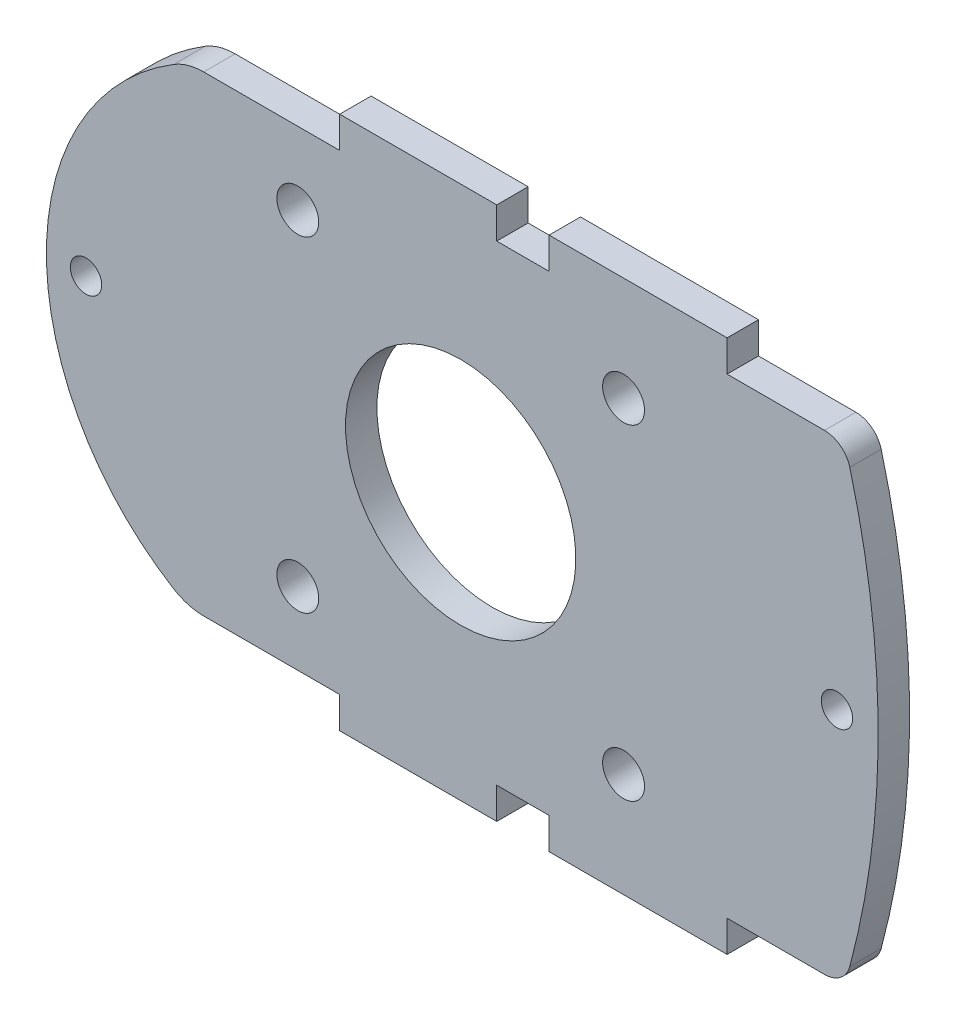
ISO-10303-21;
HEADER;
FILE_DESCRIPTION(('STEP AP214'),'2;1');
FILE_NAME('part.step','',(''),(''),'','','');
FILE_SCHEMA(('AUTOMOTIVE_DESIGN { 1 0 10303 214 1 1 1 1 }'));
ENDSEC;
DATA;
#1=APPLICATION_CONTEXT('core data for automotive mechanical design processes');
#2=APPLICATION_PROTOCOL_DEFINITION('international standard','automotive_design',2000,#1);
#3=PRODUCT_CONTEXT('',#1,'mechanical');
#4=PRODUCT('Part','Part','',(#3));
#5=PRODUCT_RELATED_PRODUCT_CATEGORY('part','',(#4));
#6=PRODUCT_DEFINITION_FORMATION('','',#4);
#7=PRODUCT_DEFINITION_CONTEXT('part definition',#1,'design');
#8=PRODUCT_DEFINITION('design','',#6,#7);
#9=PRODUCT_DEFINITION_SHAPE('','',#8);
#10=(LENGTH_UNIT() NAMED_UNIT(*) SI_UNIT(.MILLI.,.METRE.));
#11=(NAMED_UNIT(*) PLANE_ANGLE_UNIT() SI_UNIT($,.RADIAN.));
#12=(NAMED_UNIT(*) SI_UNIT($,.STERADIAN.) SOLID_ANGLE_UNIT());
#13=UNCERTAINTY_MEASURE_WITH_UNIT(LENGTH_MEASURE(1.E-05),#10,'distance_accuracy_value','');
#14=(GEOMETRIC_REPRESENTATION_CONTEXT(3) GLOBAL_UNCERTAINTY_ASSIGNED_CONTEXT((#13)) GLOBAL_UNIT_ASSIGNED_CONTEXT((#10,
#11,#12)) REPRESENTATION_CONTEXT('',''));
#15=CARTESIAN_POINT('',(0.,0.,0.));
#16=DIRECTION('',(0.,0.,1.));
#17=DIRECTION('',(1.,0.,0.));
#18=AXIS2_PLACEMENT_3D('',#15,#16,#17);
#19=CARTESIAN_POINT('',(-3343.88785458706,2589.21123471013,-96.999999999873));
#20=DIRECTION('',(0.,0.,1.));
#21=DIRECTION('',(0.,-1.,0.));
#22=AXIS2_PLACEMENT_3D('',#19,#20,#21);
#23=PLANE('',#22);
#24=CARTESIAN_POINT('',(-3061.98822352958,2945.62645905405,-96.9999999998723));
#25=DIRECTION('',(0.,0.,1.));
#26=DIRECTION('',(0.,-1.,0.));
#27=AXIS2_PLACEMENT_3D('',#24,#25,#26);
#28=CIRCLE('',#27,2.00000000000003);
#29=CARTESIAN_POINT('',(-3061.98822352958,2943.62645905405,-96.9999999998723));
#30=VERTEX_POINT('',#29);
#31=EDGE_CURVE('E256',#30,#30,#28,.F.);
#32=ORIENTED_EDGE('',*,*,#31,.T.);
#33=EDGE_LOOP('',(#32));
#34=FACE_BOUND('',#33,.T.);
#35=CARTESIAN_POINT('',(-3061.98822352958,2914.51376068184,-96.9999999998724));
#36=DIRECTION('',(0.,0.,1.));
#37=DIRECTION('',(0.,-1.,0.));
#38=AXIS2_PLACEMENT_3D('',#35,#36,#37);
#39=CIRCLE('',#38,2.00000000000003);
#40=CARTESIAN_POINT('',(-3061.98822352958,2912.51376068184,-96.9999999998724));
#41=VERTEX_POINT('',#40);
#42=EDGE_CURVE('E259',#41,#41,#39,.F.);
#43=ORIENTED_EDGE('',*,*,#42,.T.);
#44=EDGE_LOOP('',(#43));
#45=FACE_BOUND('',#44,.T.);
#46=CARTESIAN_POINT('',(-3030.87552515737,2914.51376068184,-96.9999999998724));
#47=DIRECTION('',(0.,0.,1.));
#48=DIRECTION('',(0.,-1.,0.));
#49=AXIS2_PLACEMENT_3D('',#46,#47,#48);
#50=CIRCLE('',#49,2.00000000000003);
#51=CARTESIAN_POINT('',(-3030.87552515737,2912.51376068184,-96.9999999998724));
#52=VERTEX_POINT('',#51);
#53=EDGE_CURVE('E262',#52,#52,#50,.F.);
#54=ORIENTED_EDGE('',*,*,#53,.T.);
#55=EDGE_LOOP('',(#54));
#56=FACE_BOUND('',#55,.T.);
#57=CARTESIAN_POINT('',(-3030.87552515737,2945.62645905405,-96.9999999998723));
#58=DIRECTION('',(0.,0.,1.));
#59=DIRECTION('',(0.,-1.,0.));
#60=AXIS2_PLACEMENT_3D('',#57,#58,#59);
#61=CIRCLE('',#60,2.00000000000003);
#62=CARTESIAN_POINT('',(-3030.87552515737,2943.62645905405,-96.9999999998723));
#63=VERTEX_POINT('',#62);
#64=EDGE_CURVE('E265',#63,#63,#61,.F.);
#65=ORIENTED_EDGE('',*,*,#64,.T.);
#66=EDGE_LOOP('',(#65));
#67=FACE_BOUND('',#66,.T.);
#68=CARTESIAN_POINT('',(-3046.43187434347,2930.07010986794,-96.9999999998723));
#69=DIRECTION('',(0.,0.,1.));
#70=DIRECTION('',(0.,-1.,0.));
#71=AXIS2_PLACEMENT_3D('',#68,#69,#70);
#72=CIRCLE('',#71,10.9999999999999);
#73=CARTESIAN_POINT('',(-3046.43187434347,2919.07010986794,-96.9999999998723));
#74=VERTEX_POINT('',#73);
#75=EDGE_CURVE('E268',#74,#74,#72,.F.);
#76=ORIENTED_EDGE('',*,*,#75,.T.);
#77=EDGE_LOOP('',(#76));
#78=FACE_BOUND('',#77,.T.);
#79=CARTESIAN_POINT('',(-3082.21440205393,2930.07010986794,-96.9999999998723));
#80=DIRECTION('',(0.,0.,1.));
#81=DIRECTION('',(0.,-1.,0.));
#82=AXIS2_PLACEMENT_3D('',#79,#80,#81);
#83=CIRCLE('',#82,1.50000000000006);
#84=CARTESIAN_POINT('',(-3082.21440205393,2928.57010986794,-96.9999999998723));
#85=VERTEX_POINT('',#84);
#86=EDGE_CURVE('E271',#85,#85,#83,.F.);
#87=ORIENTED_EDGE('',*,*,#86,.T.);
#88=EDGE_LOOP('',(#87));
#89=FACE_BOUND('',#88,.T.);
#90=CARTESIAN_POINT('',(-3010.49538783209,2930.07010986794,-96.9999999998724));
#91=DIRECTION('',(0.,0.,1.));
#92=DIRECTION('',(0.,-1.,0.));
#93=AXIS2_PLACEMENT_3D('',#90,#91,#92);
#94=CIRCLE('',#93,1.50000000000006);
#95=CARTESIAN_POINT('',(-3010.49538783209,2928.57010986794,-96.9999999998724));
#96=VERTEX_POINT('',#95);
#97=EDGE_CURVE('E274',#96,#96,#94,.F.);
#98=ORIENTED_EDGE('',*,*,#97,.T.);
#99=EDGE_LOOP('',(#98));
#100=FACE_BOUND('',#99,.T.);
#101=DIRECTION('',(6.78124223441046E-13,-1.,0.));
#102=VECTOR('',#101,1.);
#103=CARTESIAN_POINT('',(-3057.98822352958,2955.57010986794,-96.9999999998723));
#104=LINE('',#103,#102);
#105=CARTESIAN_POINT('',(-3057.98822352957,2952.57010986795,-96.9999999998723));
#106=VERTEX_POINT('',#105);
#107=CARTESIAN_POINT('',(-3057.98822352958,2955.57010986794,-96.9999999998723));
#108=VERTEX_POINT('',#107);
#109=EDGE_CURVE('E123',#106,#108,#104,.F.);
#110=ORIENTED_EDGE('',*,*,#109,.F.);
#111=DIRECTION('',(-1.,0.,0.));
#112=VECTOR('',#111,1.);
#113=CARTESIAN_POINT('',(-3057.98822352957,2952.57010986795,-96.9999999998723));
#114=LINE('',#113,#112);
#115=CARTESIAN_POINT('',(-3070.96940832663,2952.57010986795,-96.9999999998723));
#116=VERTEX_POINT('',#115);
#117=EDGE_CURVE('E116',#116,#106,#114,.F.);
#118=ORIENTED_EDGE('',*,*,#117,.F.);
#119=CARTESIAN_POINT('',(-3070.96940832663,2947.07010986794,-96.9999999998723));
#120=DIRECTION('',(0.,0.,1.));
#121=DIRECTION('',(0.,-1.,0.));
#122=AXIS2_PLACEMENT_3D('',#119,#120,#121);
#123=CIRCLE('',#122,5.50000000000003);
#124=CARTESIAN_POINT('',(-3073.84018359384,2951.76144756259,-96.9999999998724));
#125=VERTEX_POINT('',#124);
#126=EDGE_CURVE('E104',#125,#116,#123,.F.);
#127=ORIENTED_EDGE('',*,*,#126,.F.);
#128=CARTESIAN_POINT('',(-3060.56658023811,2930.07010986794,-96.9999999998725));
#129=DIRECTION('',(0.,0.,1.));
#130=DIRECTION('',(0.,-1.,0.));
#131=AXIS2_PLACEMENT_3D('',#128,#129,#130);
#132=CIRCLE('',#131,25.4303495262731);
#133=CARTESIAN_POINT('',(-3073.84018359384,2908.3787721733,-96.9999999998724));
#134=VERTEX_POINT('',#133);
#135=EDGE_CURVE('E19',#134,#125,#132,.F.);
#136=ORIENTED_EDGE('',*,*,#135,.F.);
#137=CARTESIAN_POINT('',(-3070.96940832663,2913.07010986794,-96.9999999998724));
#138=DIRECTION('',(0.,0.,1.));
#139=DIRECTION('',(0.,-1.,0.));
#140=AXIS2_PLACEMENT_3D('',#137,#138,#139);
#141=CIRCLE('',#140,5.49999999999927);
#142=CARTESIAN_POINT('',(-3070.96940832663,2907.57010986794,-96.9999999998724));
#143=VERTEX_POINT('',#142);
#144=EDGE_CURVE('E89',#143,#134,#141,.F.);
#145=ORIENTED_EDGE('',*,*,#144,.F.);
#146=DIRECTION('',(1.,0.,0.));
#147=VECTOR('',#146,1.);
#148=CARTESIAN_POINT('',(-3064.98822352957,2907.57010986794,-96.9999999998724));
#149=LINE('',#148,#147);
#150=CARTESIAN_POINT('',(-3057.98822352957,2907.57010986794,-96.9999999998724));
#151=VERTEX_POINT('',#150);
#152=EDGE_CURVE('E112',#151,#143,#149,.F.);
#153=ORIENTED_EDGE('',*,*,#152,.F.);
#154=DIRECTION('',(0.,-1.,0.));
#155=VECTOR('',#154,1.);
#156=CARTESIAN_POINT('',(-3057.98822352957,2907.57010986794,-96.9999999998724));
#157=LINE('',#156,#155);
#158=CARTESIAN_POINT('',(-3057.98822352957,2904.57010986794,-96.9999999998724));
#159=VERTEX_POINT('',#158);
#160=EDGE_CURVE('E213',#159,#151,#157,.F.);
#161=ORIENTED_EDGE('',*,*,#160,.F.);
#162=DIRECTION('',(1.,0.,0.));
#163=VECTOR('',#162,1.);
#164=CARTESIAN_POINT('',(-3057.98822352957,2904.57010986794,-96.9999999998724));
#165=LINE('',#164,#163);
#166=CARTESIAN_POINT('',(-3042.98822352957,2904.57010986795,-96.9999999998724));
#167=VERTEX_POINT('',#166);
#168=EDGE_CURVE('E207',#167,#159,#165,.F.);
#169=ORIENTED_EDGE('',*,*,#168,.F.);
#170=DIRECTION('',(0.,1.,0.));
#171=VECTOR('',#170,1.);
#172=CARTESIAN_POINT('',(-3042.98822352957,2904.57010986795,-96.9999999998724));
#173=LINE('',#172,#171);
#174=CARTESIAN_POINT('',(-3042.98822352957,2907.57010986794,-96.9999999998724));
#175=VERTEX_POINT('',#174);
#176=EDGE_CURVE('E201',#175,#167,#173,.F.);
#177=ORIENTED_EDGE('',*,*,#176,.F.);
#178=DIRECTION('',(1.,7.54118989476638E-13,0.));
#179=VECTOR('',#178,1.);
#180=CARTESIAN_POINT('',(-3042.98822352957,2907.57010986794,-96.9999999998724));
#181=LINE('',#180,#179);
#182=CARTESIAN_POINT('',(-3037.98822352957,2907.57010986795,-96.9999999998724));
#183=VERTEX_POINT('',#182);
#184=EDGE_CURVE('E195',#183,#175,#181,.F.);
#185=ORIENTED_EDGE('',*,*,#184,.F.);
#186=DIRECTION('',(0.,-1.,0.));
#187=VECTOR('',#186,1.);
#188=CARTESIAN_POINT('',(-3037.98822352957,2907.57010986795,-96.9999999998724));
#189=LINE('',#188,#187);
#190=CARTESIAN_POINT('',(-3037.98822352957,2904.57010986795,-96.9999999998724));
#191=VERTEX_POINT('',#190);
#192=EDGE_CURVE('E189',#191,#183,#189,.F.);
#193=ORIENTED_EDGE('',*,*,#192,.F.);
#194=DIRECTION('',(1.,0.,0.));
#195=VECTOR('',#194,1.);
#196=CARTESIAN_POINT('',(-3037.98822352957,2904.57010986795,-96.9999999998724));
#197=LINE('',#196,#195);
#198=CARTESIAN_POINT('',(-3020.98822352958,2904.57010986795,-96.9999999998724));
#199=VERTEX_POINT('',#198);
#200=EDGE_CURVE('E183',#199,#191,#197,.F.);
#201=ORIENTED_EDGE('',*,*,#200,.F.);
#202=DIRECTION('',(0.,1.,0.));
#203=VECTOR('',#202,1.);
#204=CARTESIAN_POINT('',(-3020.98822352958,2904.57010986795,-96.9999999998724));
#205=LINE('',#204,#203);
#206=CARTESIAN_POINT('',(-3020.98822352958,2907.57010986794,-96.9999999998724));
#207=VERTEX_POINT('',#206);
#208=EDGE_CURVE('E177',#207,#199,#205,.F.);
#209=ORIENTED_EDGE('',*,*,#208,.F.);
#210=DIRECTION('',(1.,4.20496970576778E-13,0.));
#211=VECTOR('',#210,1.);
#212=CARTESIAN_POINT('',(-3020.98822352958,2907.57010986794,-96.9999999998724));
#213=LINE('',#212,#211);
#214=CARTESIAN_POINT('',(-3011.68476342392,2907.57010986795,-96.9999999998725));
#215=VERTEX_POINT('',#214);
#216=EDGE_CURVE('E170',#215,#207,#213,.F.);
#217=ORIENTED_EDGE('',*,*,#216,.F.);
#218=CARTESIAN_POINT('',(-3011.68476342392,2910.07010986795,-96.9999999998725));
#219=DIRECTION('',(0.,0.,1.));
#220=DIRECTION('',(0.,-1.,0.));
#221=AXIS2_PLACEMENT_3D('',#218,#219,#220);
#222=CIRCLE('',#221,2.49999999999993);
#223=CARTESIAN_POINT('',(-3009.2694922755,2909.42476865616,-96.9999999998724));
#224=VERTEX_POINT('',#223);
#225=EDGE_CURVE('E286',#224,#215,#222,.F.);
#226=ORIENTED_EDGE('',*,*,#225,.F.);
#227=CARTESIAN_POINT('',(-3086.53729428118,2930.07010986794,-96.9999999998723));
#228=DIRECTION('',(0.,0.,1.));
#229=DIRECTION('',(0.,-1.,0.));
#230=AXIS2_PLACEMENT_3D('',#227,#228,#229);
#231=CIRCLE('',#230,79.9783929604723);
#232=CARTESIAN_POINT('',(-3009.2694922755,2950.71545107973,-96.9999999998723));
#233=VERTEX_POINT('',#232);
#234=EDGE_CURVE('E282',#233,#224,#231,.F.);
#235=ORIENTED_EDGE('',*,*,#234,.F.);
#236=CARTESIAN_POINT('',(-3011.68476342392,2950.07010986795,-96.9999999998723));
#237=DIRECTION('',(0.,0.,1.));
#238=DIRECTION('',(0.,-1.,0.));
#239=AXIS2_PLACEMENT_3D('',#236,#237,#238);
#240=CIRCLE('',#239,2.50000000000003);
#241=CARTESIAN_POINT('',(-3011.68476342392,2952.57010986795,-96.9999999998723));
#242=VERTEX_POINT('',#241);
#243=EDGE_CURVE('E279',#242,#233,#240,.F.);
#244=ORIENTED_EDGE('',*,*,#243,.F.);
#245=DIRECTION('',(-1.,0.,0.));
#246=VECTOR('',#245,1.);
#247=CARTESIAN_POINT('',(-3011.87552515737,2952.57010986795,-96.9999999998723));
#248=LINE('',#247,#246);
#249=CARTESIAN_POINT('',(-3020.98822352957,2952.57010986795,-96.9999999998723));
#250=VERTEX_POINT('',#249);
#251=EDGE_CURVE('E162',#250,#242,#248,.F.);
#252=ORIENTED_EDGE('',*,*,#251,.F.);
#253=DIRECTION('',(0.,1.,0.));
#254=VECTOR('',#253,1.);
#255=CARTESIAN_POINT('',(-3020.98822352957,2952.57010986795,-96.9999999998723));
#256=LINE('',#255,#254);
#257=CARTESIAN_POINT('',(-3020.98822352957,2955.57010986794,-96.9999999998723));
#258=VERTEX_POINT('',#257);
#259=EDGE_CURVE('E159',#258,#250,#256,.F.);
#260=ORIENTED_EDGE('',*,*,#259,.F.);
#261=DIRECTION('',(-1.,0.,0.));
#262=VECTOR('',#261,1.);
#263=CARTESIAN_POINT('',(-3020.98822352957,2955.57010986794,-96.9999999998723));
#264=LINE('',#263,#262);
#265=CARTESIAN_POINT('',(-3037.98822352958,2955.57010986794,-96.9999999998723));
#266=VERTEX_POINT('',#265);
#267=EDGE_CURVE('E153',#266,#258,#264,.F.);
#268=ORIENTED_EDGE('',*,*,#267,.F.);
#269=DIRECTION('',(0.,-1.,0.));
#270=VECTOR('',#269,1.);
#271=CARTESIAN_POINT('',(-3037.98822352958,2955.57010986794,-96.9999999998723));
#272=LINE('',#271,#270);
#273=CARTESIAN_POINT('',(-3037.98822352958,2952.57010986795,-96.9999999998723));
#274=VERTEX_POINT('',#273);
#275=EDGE_CURVE('E147',#274,#266,#272,.F.);
#276=ORIENTED_EDGE('',*,*,#275,.F.);
#277=DIRECTION('',(-1.,0.,0.));
#278=VECTOR('',#277,1.);
#279=CARTESIAN_POINT('',(-3037.98822352958,2952.57010986795,-96.9999999998723));
#280=LINE('',#279,#278);
#281=CARTESIAN_POINT('',(-3042.98822352958,2952.57010986795,-96.9999999998723));
#282=VERTEX_POINT('',#281);
#283=EDGE_CURVE('E141',#282,#274,#280,.F.);
#284=ORIENTED_EDGE('',*,*,#283,.F.);
#285=DIRECTION('',(0.,1.,0.));
#286=VECTOR('',#285,1.);
#287=CARTESIAN_POINT('',(-3042.98822352958,2952.57010986795,-96.9999999998723));
#288=LINE('',#287,#286);
#289=CARTESIAN_POINT('',(-3042.98822352957,2955.57010986794,-96.9999999998723));
#290=VERTEX_POINT('',#289);
#291=EDGE_CURVE('E135',#290,#282,#288,.F.);
#292=ORIENTED_EDGE('',*,*,#291,.F.);
#293=DIRECTION('',(-1.,0.,0.));
#294=VECTOR('',#293,1.);
#295=CARTESIAN_POINT('',(-3042.98822352957,2955.57010986794,-96.9999999998723));
#296=LINE('',#295,#294);
#297=EDGE_CURVE('E129',#108,#290,#296,.F.);
#298=ORIENTED_EDGE('',*,*,#297,.F.);
#299=EDGE_LOOP('',(#110,#118,#127,#136,#145,#153,#161,#169,#177,#185,#193,#201,#209,#217,#226,
#235,#244,#252,#260,#268,#276,#284,#292,#298));
#300=FACE_BOUND('',#299,.T.);
#301=ADVANCED_FACE('F16',(#34,#45,#56,#67,#78,#89,#100,#300),#23,.T.);
#302=CARTESIAN_POINT('',(-3060.56658023811,2930.07010986794,-99.9999999998723));
#303=DIRECTION('',(0.,0.,1.));
#304=DIRECTION('',(0.,-1.,0.));
#305=AXIS2_PLACEMENT_3D('',#302,#303,#304);
#306=CYLINDRICAL_SURFACE('',#305,25.4303495262731);
#307=DIRECTION('',(0.,0.,1.));
#308=VECTOR('',#307,1.);
#309=CARTESIAN_POINT('',(-3073.84018359384,2908.3787721733,-99.9999999998724));
#310=LINE('',#309,#308);
#311=CARTESIAN_POINT('',(-3073.84018359384,2908.3787721733,-99.9999999998724));
#312=VERTEX_POINT('',#311);
#313=EDGE_CURVE('E94',#134,#312,#310,.F.);
#314=ORIENTED_EDGE('',*,*,#313,.F.);
#315=ORIENTED_EDGE('',*,*,#135,.T.);
#316=DIRECTION('',(0.,0.,1.));
#317=VECTOR('',#316,1.);
#318=CARTESIAN_POINT('',(-3073.84018359384,2951.76144756259,-99.9999999998723));
#319=LINE('',#318,#317);
#320=CARTESIAN_POINT('',(-3073.84018359384,2951.76144756259,-99.9999999998722));
#321=VERTEX_POINT('',#320);
#322=EDGE_CURVE('E277',#321,#125,#319,.T.);
#323=ORIENTED_EDGE('',*,*,#322,.F.);
#324=CARTESIAN_POINT('',(-3060.56658023811,2930.07010986794,-99.9999999998723));
#325=DIRECTION('',(0.,0.,1.));
#326=DIRECTION('',(0.,-1.,0.));
#327=AXIS2_PLACEMENT_3D('',#324,#325,#326);
#328=CIRCLE('',#327,25.4303495262731);
#329=EDGE_CURVE('E110',#321,#312,#328,.T.);
#330=ORIENTED_EDGE('',*,*,#329,.T.);
#331=EDGE_LOOP('',(#314,#315,#323,#330));
#332=FACE_BOUND('',#331,.T.);
#333=ADVANCED_FACE('F109',(#332),#306,.T.);
#334=CARTESIAN_POINT('',(-3070.96940832663,2913.07010986794,-99.9999999998724));
#335=DIRECTION('',(0.,0.,1.));
#336=DIRECTION('',(0.,-1.,0.));
#337=AXIS2_PLACEMENT_3D('',#334,#335,#336);
#338=CYLINDRICAL_SURFACE('',#337,5.49999999999927);
#339=CARTESIAN_POINT('',(-3070.96940832663,2913.07010986794,-99.9999999998724));
#340=DIRECTION('',(0.,0.,1.));
#341=DIRECTION('',(0.,-1.,0.));
#342=AXIS2_PLACEMENT_3D('',#339,#340,#341);
#343=CIRCLE('',#342,5.49999999999927);
#344=CARTESIAN_POINT('',(-3070.96940832663,2907.57010986794,-99.9999999998725));
#345=VERTEX_POINT('',#344);
#346=EDGE_CURVE('E252',#312,#345,#343,.T.);
#347=ORIENTED_EDGE('',*,*,#346,.T.);
#348=DIRECTION('',(0.,0.,1.));
#349=VECTOR('',#348,1.);
#350=CARTESIAN_POINT('',(-3070.96940832663,2907.57010986794,-99.9999999998724));
#351=LINE('',#350,#349);
#352=EDGE_CURVE('E96',#143,#345,#351,.F.);
#353=ORIENTED_EDGE('',*,*,#352,.F.);
#354=ORIENTED_EDGE('',*,*,#144,.T.);
#355=ORIENTED_EDGE('',*,*,#313,.T.);
#356=EDGE_LOOP('',(#347,#353,#354,#355));
#357=FACE_BOUND('',#356,.T.);
#358=ADVANCED_FACE('F92',(#357),#338,.T.);
#359=CARTESIAN_POINT('',(-3064.98822352957,2907.57010986794,-99.9999999998724));
#360=DIRECTION('',(0.,-1.,0.));
#361=DIRECTION('',(1.,0.,0.));
#362=AXIS2_PLACEMENT_3D('',#359,#360,#361);
#363=PLANE('',#362);
#364=DIRECTION('',(0.,0.,1.));
#365=VECTOR('',#364,1.);
#366=CARTESIAN_POINT('',(-3057.98822352957,2907.57010986794,-99.9999999998724));
#367=LINE('',#366,#365);
#368=CARTESIAN_POINT('',(-3057.98822352957,2907.57010986794,-99.9999999998726));
#369=VERTEX_POINT('',#368);
#370=EDGE_CURVE('E210',#151,#369,#367,.F.);
#371=ORIENTED_EDGE('',*,*,#370,.F.);
#372=ORIENTED_EDGE('',*,*,#152,.T.);
#373=ORIENTED_EDGE('',*,*,#352,.T.);
#374=DIRECTION('',(1.,0.,0.));
#375=VECTOR('',#374,1.);
#376=CARTESIAN_POINT('',(-3343.88785458706,2907.57010986794,-99.9999999998724));
#377=LINE('',#376,#375);
#378=EDGE_CURVE('E254',#345,#369,#377,.T.);
#379=ORIENTED_EDGE('',*,*,#378,.T.);
#380=EDGE_LOOP('',(#371,#372,#373,#379));
#381=FACE_BOUND('',#380,.T.);
#382=ADVANCED_FACE('F379',(#381),#363,.T.);
#383=CARTESIAN_POINT('',(-3057.98822352957,2907.57010986794,-99.9999999998724));
#384=DIRECTION('',(-1.,0.,0.));
#385=DIRECTION('',(0.,-1.,0.));
#386=AXIS2_PLACEMENT_3D('',#383,#384,#385);
#387=PLANE('',#386);
#388=ORIENTED_EDGE('',*,*,#160,.T.);
#389=ORIENTED_EDGE('',*,*,#370,.T.);
#390=DIRECTION('',(0.,-1.,0.));
#391=VECTOR('',#390,1.);
#392=CARTESIAN_POINT('',(-3057.98822352957,2589.21123471013,-99.9999999998732));
#393=LINE('',#392,#391);
#394=CARTESIAN_POINT('',(-3057.98822352957,2904.57010986794,-99.9999999998726));
#395=VERTEX_POINT('',#394);
#396=EDGE_CURVE('E350',#369,#395,#393,.T.);
#397=ORIENTED_EDGE('',*,*,#396,.T.);
#398=DIRECTION('',(0.,0.,1.));
#399=VECTOR('',#398,1.);
#400=CARTESIAN_POINT('',(-3057.98822352957,2904.57010986794,-99.9999999998724));
#401=LINE('',#400,#399);
#402=EDGE_CURVE('E204',#159,#395,#401,.F.);
#403=ORIENTED_EDGE('',*,*,#402,.F.);
#404=EDGE_LOOP('',(#388,#389,#397,#403));
#405=FACE_BOUND('',#404,.T.);
#406=ADVANCED_FACE('F366',(#405),#387,.T.);
#407=CARTESIAN_POINT('',(-3057.98822352957,2904.57010986794,-99.9999999998724));
#408=DIRECTION('',(0.,-1.,0.));
#409=DIRECTION('',(1.,0.,0.));
#410=AXIS2_PLACEMENT_3D('',#407,#408,#409);
#411=PLANE('',#410);
#412=ORIENTED_EDGE('',*,*,#168,.T.);
#413=ORIENTED_EDGE('',*,*,#402,.T.);
#414=DIRECTION('',(1.,0.,0.));
#415=VECTOR('',#414,1.);
#416=CARTESIAN_POINT('',(-3343.88785458706,2904.57010986794,-99.9999999998724));
#417=LINE('',#416,#415);
#418=CARTESIAN_POINT('',(-3042.98822352957,2904.57010986794,-99.9999999998726));
#419=VERTEX_POINT('',#418);
#420=EDGE_CURVE('E341',#395,#419,#417,.T.);
#421=ORIENTED_EDGE('',*,*,#420,.T.);
#422=DIRECTION('',(0.,0.,1.));
#423=VECTOR('',#422,1.);
#424=CARTESIAN_POINT('',(-3042.98822352957,2904.57010986795,-99.9999999998724));
#425=LINE('',#424,#423);
#426=EDGE_CURVE('E198',#167,#419,#425,.F.);
#427=ORIENTED_EDGE('',*,*,#426,.F.);
#428=EDGE_LOOP('',(#412,#413,#421,#427));
#429=FACE_BOUND('',#428,.T.);
#430=ADVANCED_FACE('F543',(#429),#411,.T.);
#431=CARTESIAN_POINT('',(-3042.98822352957,2904.57010986795,-99.9999999998724));
#432=DIRECTION('',(1.,0.,0.));
#433=DIRECTION('',(0.,1.,0.));
#434=AXIS2_PLACEMENT_3D('',#431,#432,#433);
#435=PLANE('',#434);
#436=ORIENTED_EDGE('',*,*,#176,.T.);
#437=ORIENTED_EDGE('',*,*,#426,.T.);
#438=DIRECTION('',(0.,-1.,0.));
#439=VECTOR('',#438,1.);
#440=CARTESIAN_POINT('',(-3042.98822352957,2589.21123471013,-99.9999999998732));
#441=LINE('',#440,#439);
#442=CARTESIAN_POINT('',(-3042.98822352957,2907.57010986794,-99.9999999998726));
#443=VERTEX_POINT('',#442);
#444=EDGE_CURVE('E332',#419,#443,#441,.F.);
#445=ORIENTED_EDGE('',*,*,#444,.T.);
#446=DIRECTION('',(0.,0.,1.));
#447=VECTOR('',#446,1.);
#448=CARTESIAN_POINT('',(-3042.98822352957,2907.57010986794,-99.9999999998724));
#449=LINE('',#448,#447);
#450=EDGE_CURVE('E192',#175,#443,#449,.F.);
#451=ORIENTED_EDGE('',*,*,#450,.F.);
#452=EDGE_LOOP('',(#436,#437,#445,#451));
#453=FACE_BOUND('',#452,.T.);
#454=ADVANCED_FACE('F550',(#453),#435,.T.);
#455=CARTESIAN_POINT('',(-3042.98822352957,2907.57010986794,-99.9999999998724));
#456=DIRECTION('',(7.54118989476638E-13,-1.,0.));
#457=DIRECTION('',(1.,7.54118989476638E-13,0.));
#458=AXIS2_PLACEMENT_3D('',#455,#456,#457);
#459=PLANE('',#458);
#460=ORIENTED_EDGE('',*,*,#184,.T.);
#461=ORIENTED_EDGE('',*,*,#450,.T.);
#462=DIRECTION('',(1.,0.,0.));
#463=VECTOR('',#462,1.);
#464=CARTESIAN_POINT('',(-3343.88785458706,2907.57010986794,-99.9999999998724));
#465=LINE('',#464,#463);
#466=CARTESIAN_POINT('',(-3037.98822352957,2907.57010986794,-99.9999999998726));
#467=VERTEX_POINT('',#466);
#468=EDGE_CURVE('E323',#443,#467,#465,.T.);
#469=ORIENTED_EDGE('',*,*,#468,.T.);
#470=DIRECTION('',(0.,0.,1.));
#471=VECTOR('',#470,1.);
#472=CARTESIAN_POINT('',(-3037.98822352957,2907.57010986795,-99.9999999998724));
#473=LINE('',#472,#471);
#474=EDGE_CURVE('E186',#183,#467,#473,.F.);
#475=ORIENTED_EDGE('',*,*,#474,.F.);
#476=EDGE_LOOP('',(#460,#461,#469,#475));
#477=FACE_BOUND('',#476,.T.);
#478=ADVANCED_FACE('F553',(#477),#459,.T.);
#479=CARTESIAN_POINT('',(-3037.98822352957,2907.57010986795,-99.9999999998724));
#480=DIRECTION('',(-1.,0.,0.));
#481=DIRECTION('',(0.,-1.,0.));
#482=AXIS2_PLACEMENT_3D('',#479,#480,#481);
#483=PLANE('',#482);
#484=ORIENTED_EDGE('',*,*,#192,.T.);
#485=ORIENTED_EDGE('',*,*,#474,.T.);
#486=DIRECTION('',(0.,-1.,0.));
#487=VECTOR('',#486,1.);
#488=CARTESIAN_POINT('',(-3037.98822352957,2589.21123471013,-99.9999999998732));
#489=LINE('',#488,#487);
#490=CARTESIAN_POINT('',(-3037.98822352957,2904.57010986795,-99.9999999998726));
#491=VERTEX_POINT('',#490);
#492=EDGE_CURVE('E314',#467,#491,#489,.T.);
#493=ORIENTED_EDGE('',*,*,#492,.T.);
#494=DIRECTION('',(0.,0.,1.));
#495=VECTOR('',#494,1.);
#496=CARTESIAN_POINT('',(-3037.98822352957,2904.57010986795,-99.9999999998724));
#497=LINE('',#496,#495);
#498=EDGE_CURVE('E180',#191,#491,#497,.F.);
#499=ORIENTED_EDGE('',*,*,#498,.F.);
#500=EDGE_LOOP('',(#484,#485,#493,#499));
#501=FACE_BOUND('',#500,.T.);
#502=ADVANCED_FACE('F558',(#501),#483,.T.);
#503=CARTESIAN_POINT('',(-3037.98822352957,2904.57010986795,-99.9999999998724));
#504=DIRECTION('',(0.,-1.,0.));
#505=DIRECTION('',(1.,0.,0.));
#506=AXIS2_PLACEMENT_3D('',#503,#504,#505);
#507=PLANE('',#506);
#508=ORIENTED_EDGE('',*,*,#200,.T.);
#509=ORIENTED_EDGE('',*,*,#498,.T.);
#510=DIRECTION('',(1.,0.,0.));
#511=VECTOR('',#510,1.);
#512=CARTESIAN_POINT('',(-3343.88785458706,2904.57010986795,-99.9999999998724));
#513=LINE('',#512,#511);
#514=CARTESIAN_POINT('',(-3020.98822352958,2904.57010986795,-99.9999999998726));
#515=VERTEX_POINT('',#514);
#516=EDGE_CURVE('E305',#491,#515,#513,.T.);
#517=ORIENTED_EDGE('',*,*,#516,.T.);
#518=DIRECTION('',(0.,0.,1.));
#519=VECTOR('',#518,1.);
#520=CARTESIAN_POINT('',(-3020.98822352958,2904.57010986795,-99.9999999998724));
#521=LINE('',#520,#519);
#522=EDGE_CURVE('E174',#199,#515,#521,.F.);
#523=ORIENTED_EDGE('',*,*,#522,.F.);
#524=EDGE_LOOP('',(#508,#509,#517,#523));
#525=FACE_BOUND('',#524,.T.);
#526=ADVANCED_FACE('F562',(#525),#507,.T.);
#527=CARTESIAN_POINT('',(-3020.98822352958,2904.57010986795,-99.9999999998724));
#528=DIRECTION('',(1.,0.,0.));
#529=DIRECTION('',(0.,1.,0.));
#530=AXIS2_PLACEMENT_3D('',#527,#528,#529);
#531=PLANE('',#530);
#532=ORIENTED_EDGE('',*,*,#208,.T.);
#533=ORIENTED_EDGE('',*,*,#522,.T.);
#534=DIRECTION('',(0.,-1.,0.));
#535=VECTOR('',#534,1.);
#536=CARTESIAN_POINT('',(-3020.98822352958,2589.21123471013,-99.9999999998732));
#537=LINE('',#536,#535);
#538=CARTESIAN_POINT('',(-3020.98822352958,2907.57010986794,-99.9999999998726));
#539=VERTEX_POINT('',#538);
#540=EDGE_CURVE('E302',#515,#539,#537,.F.);
#541=ORIENTED_EDGE('',*,*,#540,.T.);
#542=DIRECTION('',(0.,0.,1.));
#543=VECTOR('',#542,1.);
#544=CARTESIAN_POINT('',(-3020.98822352958,2907.57010986794,-99.9999999998724));
#545=LINE('',#544,#543);
#546=EDGE_CURVE('E173',#207,#539,#545,.F.);
#547=ORIENTED_EDGE('',*,*,#546,.F.);
#548=EDGE_LOOP('',(#532,#533,#541,#547));
#549=FACE_BOUND('',#548,.T.);
#550=ADVANCED_FACE('F564',(#549),#531,.T.);
#551=CARTESIAN_POINT('',(-3020.98822352958,2907.57010986794,-99.9999999998724));
#552=DIRECTION('',(4.20496970576778E-13,-1.,0.));
#553=DIRECTION('',(1.,4.20496970576778E-13,0.));
#554=AXIS2_PLACEMENT_3D('',#551,#552,#553);
#555=PLANE('',#554);
#556=ORIENTED_EDGE('',*,*,#546,.T.);
#557=DIRECTION('',(1.,0.,0.));
#558=VECTOR('',#557,1.);
#559=CARTESIAN_POINT('',(-3343.88785458706,2907.57010986794,-99.9999999998724));
#560=LINE('',#559,#558);
#561=CARTESIAN_POINT('',(-3011.68476342392,2907.57010986795,-99.9999999998724));
#562=VERTEX_POINT('',#561);
#563=EDGE_CURVE('E251',#539,#562,#560,.T.);
#564=ORIENTED_EDGE('',*,*,#563,.T.);
#565=DIRECTION('',(0.,0.,1.));
#566=VECTOR('',#565,1.);
#567=CARTESIAN_POINT('',(-3011.68476342392,2907.57010986795,-99.9999999998724));
#568=LINE('',#567,#566);
#569=EDGE_CURVE('E287',#215,#562,#568,.F.);
#570=ORIENTED_EDGE('',*,*,#569,.F.);
#571=ORIENTED_EDGE('',*,*,#216,.T.);
#572=EDGE_LOOP('',(#556,#564,#570,#571));
#573=FACE_BOUND('',#572,.T.);
#574=ADVANCED_FACE('F466',(#573),#555,.T.);
#575=CARTESIAN_POINT('',(-3011.68476342392,2910.07010986795,-99.9999999998724));
#576=DIRECTION('',(0.,0.,1.));
#577=DIRECTION('',(0.,-1.,0.));
#578=AXIS2_PLACEMENT_3D('',#575,#576,#577);
#579=CYLINDRICAL_SURFACE('',#578,2.49999999999993);
#580=CARTESIAN_POINT('',(-3011.68476342392,2910.07010986795,-99.9999999998724));
#581=DIRECTION('',(0.,0.,1.));
#582=DIRECTION('',(0.,-1.,0.));
#583=AXIS2_PLACEMENT_3D('',#580,#581,#582);
#584=CIRCLE('',#583,2.49999999999993);
#585=CARTESIAN_POINT('',(-3009.2694922755,2909.42476865616,-99.9999999998724));
#586=VERTEX_POINT('',#585);
#587=EDGE_CURVE('E248',#562,#586,#584,.T.);
#588=ORIENTED_EDGE('',*,*,#587,.T.);
#589=DIRECTION('',(0.,0.,1.));
#590=VECTOR('',#589,1.);
#591=CARTESIAN_POINT('',(-3009.2694922755,2909.42476865616,-99.9999999998724));
#592=LINE('',#591,#590);
#593=EDGE_CURVE('E285',#224,#586,#592,.F.);
#594=ORIENTED_EDGE('',*,*,#593,.F.);
#595=ORIENTED_EDGE('',*,*,#225,.T.);
#596=ORIENTED_EDGE('',*,*,#569,.T.);
#597=EDGE_LOOP('',(#588,#594,#595,#596));
#598=FACE_BOUND('',#597,.T.);
#599=ADVANCED_FACE('F464',(#598),#579,.T.);
#600=CARTESIAN_POINT('',(-3086.53729428118,2930.07010986794,-99.9999999998723));
#601=DIRECTION('',(0.,0.,1.));
#602=DIRECTION('',(0.,-1.,0.));
#603=AXIS2_PLACEMENT_3D('',#600,#601,#602);
#604=CYLINDRICAL_SURFACE('',#603,79.9783929604723);
#605=DIRECTION('',(0.,0.,1.));
#606=VECTOR('',#605,1.);
#607=CARTESIAN_POINT('',(-3009.2694922755,2950.71545107973,-99.9999999998723));
#608=LINE('',#607,#606);
#609=CARTESIAN_POINT('',(-3009.2694922755,2950.71545107973,-99.9999999998723));
#610=VERTEX_POINT('',#609);
#611=EDGE_CURVE('E281',#233,#610,#608,.F.);
#612=ORIENTED_EDGE('',*,*,#611,.F.);
#613=ORIENTED_EDGE('',*,*,#234,.T.);
#614=ORIENTED_EDGE('',*,*,#593,.T.);
#615=CARTESIAN_POINT('',(-3086.53729428118,2930.07010986794,-99.9999999998723));
#616=DIRECTION('',(0.,0.,1.));
#617=DIRECTION('',(0.,-1.,0.));
#618=AXIS2_PLACEMENT_3D('',#615,#616,#617);
#619=CIRCLE('',#618,79.9783929604723);
#620=EDGE_CURVE('E245',#586,#610,#619,.T.);
#621=ORIENTED_EDGE('',*,*,#620,.T.);
#622=EDGE_LOOP('',(#612,#613,#614,#621));
#623=FACE_BOUND('',#622,.T.);
#624=ADVANCED_FACE('F459',(#623),#604,.T.);
#625=CARTESIAN_POINT('',(-3011.68476342392,2950.07010986795,-99.9999999998723));
#626=DIRECTION('',(0.,0.,1.));
#627=DIRECTION('',(0.,-1.,0.));
#628=AXIS2_PLACEMENT_3D('',#625,#626,#627);
#629=CYLINDRICAL_SURFACE('',#628,2.50000000000003);
#630=CARTESIAN_POINT('',(-3011.68476342392,2950.07010986795,-99.9999999998723));
#631=DIRECTION('',(0.,0.,1.));
#632=DIRECTION('',(0.,-1.,0.));
#633=AXIS2_PLACEMENT_3D('',#630,#631,#632);
#634=CIRCLE('',#633,2.50000000000003);
#635=CARTESIAN_POINT('',(-3011.68476342392,2952.57010986795,-99.9999999998724));
#636=VERTEX_POINT('',#635);
#637=EDGE_CURVE('E241',#610,#636,#634,.T.);
#638=ORIENTED_EDGE('',*,*,#637,.T.);
#639=DIRECTION('',(0.,0.,1.));
#640=VECTOR('',#639,1.);
#641=CARTESIAN_POINT('',(-3011.68476342392,2952.57010986795,-99.9999999998723));
#642=LINE('',#641,#640);
#643=EDGE_CURVE('E167',#242,#636,#642,.F.);
#644=ORIENTED_EDGE('',*,*,#643,.F.);
#645=ORIENTED_EDGE('',*,*,#243,.T.);
#646=ORIENTED_EDGE('',*,*,#611,.T.);
#647=EDGE_LOOP('',(#638,#644,#645,#646));
#648=FACE_BOUND('',#647,.T.);
#649=ADVANCED_FACE('F642',(#648),#629,.T.);
#650=CARTESIAN_POINT('',(-3011.87552515737,2952.57010986795,-99.9999999998723));
#651=DIRECTION('',(0.,1.,0.));
#652=DIRECTION('',(-1.,0.,0.));
#653=AXIS2_PLACEMENT_3D('',#650,#651,#652);
#654=PLANE('',#653);
#655=DIRECTION('',(0.,0.,1.));
#656=VECTOR('',#655,1.);
#657=CARTESIAN_POINT('',(-3020.98822352957,2952.57010986795,-99.9999999998723));
#658=LINE('',#657,#656);
#659=CARTESIAN_POINT('',(-3020.98822352957,2952.57010986795,-99.9999999998725));
#660=VERTEX_POINT('',#659);
#661=EDGE_CURVE('E156',#250,#660,#658,.F.);
#662=ORIENTED_EDGE('',*,*,#661,.F.);
#663=ORIENTED_EDGE('',*,*,#251,.T.);
#664=ORIENTED_EDGE('',*,*,#643,.T.);
#665=DIRECTION('',(1.,0.,0.));
#666=VECTOR('',#665,1.);
#667=CARTESIAN_POINT('',(-3343.88785458706,2952.57010986795,-99.9999999998723));
#668=LINE('',#667,#666);
#669=EDGE_CURVE('E244',#636,#660,#668,.F.);
#670=ORIENTED_EDGE('',*,*,#669,.T.);
#671=EDGE_LOOP('',(#662,#663,#664,#670));
#672=FACE_BOUND('',#671,.T.);
#673=ADVANCED_FACE('F638',(#672),#654,.T.);
#674=CARTESIAN_POINT('',(-3020.98822352957,2952.57010986795,-99.9999999998723));
#675=DIRECTION('',(1.,0.,0.));
#676=DIRECTION('',(0.,1.,0.));
#677=AXIS2_PLACEMENT_3D('',#674,#675,#676);
#678=PLANE('',#677);
#679=ORIENTED_EDGE('',*,*,#259,.T.);
#680=ORIENTED_EDGE('',*,*,#661,.T.);
#681=DIRECTION('',(0.,-1.,0.));
#682=VECTOR('',#681,1.);
#683=CARTESIAN_POINT('',(-3020.98822352957,2589.21123471013,-99.9999999998732));
#684=LINE('',#683,#682);
#685=CARTESIAN_POINT('',(-3020.98822352957,2955.57010986794,-99.9999999998725));
#686=VERTEX_POINT('',#685);
#687=EDGE_CURVE('E440',#660,#686,#684,.F.);
#688=ORIENTED_EDGE('',*,*,#687,.T.);
#689=DIRECTION('',(0.,0.,1.));
#690=VECTOR('',#689,1.);
#691=CARTESIAN_POINT('',(-3020.98822352957,2955.57010986794,-99.9999999998723));
#692=LINE('',#691,#690);
#693=EDGE_CURVE('E150',#258,#686,#692,.F.);
#694=ORIENTED_EDGE('',*,*,#693,.F.);
#695=EDGE_LOOP('',(#679,#680,#688,#694));
#696=FACE_BOUND('',#695,.T.);
#697=ADVANCED_FACE('F634',(#696),#678,.T.);
#698=CARTESIAN_POINT('',(-3020.98822352957,2955.57010986794,-99.9999999998723));
#699=DIRECTION('',(0.,1.,0.));
#700=DIRECTION('',(-1.,0.,0.));
#701=AXIS2_PLACEMENT_3D('',#698,#699,#700);
#702=PLANE('',#701);
#703=ORIENTED_EDGE('',*,*,#267,.T.);
#704=ORIENTED_EDGE('',*,*,#693,.T.);
#705=DIRECTION('',(1.,0.,0.));
#706=VECTOR('',#705,1.);
#707=CARTESIAN_POINT('',(-3343.88785458706,2955.57010986794,-99.9999999998723));
#708=LINE('',#707,#706);
#709=CARTESIAN_POINT('',(-3037.98822352958,2955.57010986794,-99.9999999998725));
#710=VERTEX_POINT('',#709);
#711=EDGE_CURVE('E431',#686,#710,#708,.F.);
#712=ORIENTED_EDGE('',*,*,#711,.T.);
#713=DIRECTION('',(0.,0.,1.));
#714=VECTOR('',#713,1.);
#715=CARTESIAN_POINT('',(-3037.98822352958,2955.57010986794,-99.9999999998723));
#716=LINE('',#715,#714);
#717=EDGE_CURVE('E144',#266,#710,#716,.F.);
#718=ORIENTED_EDGE('',*,*,#717,.F.);
#719=EDGE_LOOP('',(#703,#704,#712,#718));
#720=FACE_BOUND('',#719,.T.);
#721=ADVANCED_FACE('F630',(#720),#702,.T.);
#722=CARTESIAN_POINT('',(-3037.98822352958,2955.57010986794,-99.9999999998723));
#723=DIRECTION('',(-1.,0.,0.));
#724=DIRECTION('',(0.,-1.,0.));
#725=AXIS2_PLACEMENT_3D('',#722,#723,#724);
#726=PLANE('',#725);
#727=ORIENTED_EDGE('',*,*,#275,.T.);
#728=ORIENTED_EDGE('',*,*,#717,.T.);
#729=DIRECTION('',(0.,-1.,0.));
#730=VECTOR('',#729,1.);
#731=CARTESIAN_POINT('',(-3037.98822352958,2589.21123471013,-99.9999999998732));
#732=LINE('',#731,#730);
#733=CARTESIAN_POINT('',(-3037.98822352958,2952.57010986795,-99.9999999998725));
#734=VERTEX_POINT('',#733);
#735=EDGE_CURVE('E422',#710,#734,#732,.T.);
#736=ORIENTED_EDGE('',*,*,#735,.T.);
#737=DIRECTION('',(0.,0.,1.));
#738=VECTOR('',#737,1.);
#739=CARTESIAN_POINT('',(-3037.98822352958,2952.57010986795,-99.9999999998723));
#740=LINE('',#739,#738);
#741=EDGE_CURVE('E138',#274,#734,#740,.F.);
#742=ORIENTED_EDGE('',*,*,#741,.F.);
#743=EDGE_LOOP('',(#727,#728,#736,#742));
#744=FACE_BOUND('',#743,.T.);
#745=ADVANCED_FACE('F626',(#744),#726,.T.);
#746=CARTESIAN_POINT('',(-3037.98822352958,2952.57010986795,-99.9999999998723));
#747=DIRECTION('',(0.,1.,0.));
#748=DIRECTION('',(-1.,0.,0.));
#749=AXIS2_PLACEMENT_3D('',#746,#747,#748);
#750=PLANE('',#749);
#751=ORIENTED_EDGE('',*,*,#283,.T.);
#752=ORIENTED_EDGE('',*,*,#741,.T.);
#753=DIRECTION('',(1.,0.,0.));
#754=VECTOR('',#753,1.);
#755=CARTESIAN_POINT('',(-3343.88785458706,2952.57010986795,-99.9999999998723));
#756=LINE('',#755,#754);
#757=CARTESIAN_POINT('',(-3042.98822352958,2952.57010986795,-99.9999999998725));
#758=VERTEX_POINT('',#757);
#759=EDGE_CURVE('E413',#734,#758,#756,.F.);
#760=ORIENTED_EDGE('',*,*,#759,.T.);
#761=DIRECTION('',(0.,0.,1.));
#762=VECTOR('',#761,1.);
#763=CARTESIAN_POINT('',(-3042.98822352958,2952.57010986795,-99.9999999998723));
#764=LINE('',#763,#762);
#765=EDGE_CURVE('E132',#282,#758,#764,.F.);
#766=ORIENTED_EDGE('',*,*,#765,.F.);
#767=EDGE_LOOP('',(#751,#752,#760,#766));
#768=FACE_BOUND('',#767,.T.);
#769=ADVANCED_FACE('F622',(#768),#750,.T.);
#770=CARTESIAN_POINT('',(-3042.98822352958,2952.57010986795,-99.9999999998723));
#771=DIRECTION('',(1.,0.,0.));
#772=DIRECTION('',(0.,1.,0.));
#773=AXIS2_PLACEMENT_3D('',#770,#771,#772);
#774=PLANE('',#773);
#775=ORIENTED_EDGE('',*,*,#291,.T.);
#776=ORIENTED_EDGE('',*,*,#765,.T.);
#777=DIRECTION('',(0.,-1.,0.));
#778=VECTOR('',#777,1.);
#779=CARTESIAN_POINT('',(-3042.98822352958,2589.21123471013,-99.9999999998732));
#780=LINE('',#779,#778);
#781=CARTESIAN_POINT('',(-3042.98822352958,2955.57010986794,-99.9999999998725));
#782=VERTEX_POINT('',#781);
#783=EDGE_CURVE('E404',#758,#782,#780,.F.);
#784=ORIENTED_EDGE('',*,*,#783,.T.);
#785=DIRECTION('',(0.,0.,1.));
#786=VECTOR('',#785,1.);
#787=CARTESIAN_POINT('',(-3042.98822352957,2955.57010986794,-99.9999999998723));
#788=LINE('',#787,#786);
#789=EDGE_CURVE('E126',#290,#782,#788,.F.);
#790=ORIENTED_EDGE('',*,*,#789,.F.);
#791=EDGE_LOOP('',(#775,#776,#784,#790));
#792=FACE_BOUND('',#791,.T.);
#793=ADVANCED_FACE('F619',(#792),#774,.T.);
#794=CARTESIAN_POINT('',(-3042.98822352957,2955.57010986794,-99.9999999998723));
#795=DIRECTION('',(0.,1.,0.));
#796=DIRECTION('',(-1.,0.,0.));
#797=AXIS2_PLACEMENT_3D('',#794,#795,#796);
#798=PLANE('',#797);
#799=ORIENTED_EDGE('',*,*,#297,.T.);
#800=ORIENTED_EDGE('',*,*,#789,.T.);
#801=DIRECTION('',(1.,0.,0.));
#802=VECTOR('',#801,1.);
#803=CARTESIAN_POINT('',(-3343.88785458706,2955.57010986794,-99.9999999998723));
#804=LINE('',#803,#802);
#805=CARTESIAN_POINT('',(-3057.98822352958,2955.57010986794,-99.9999999998725));
#806=VERTEX_POINT('',#805);
#807=EDGE_CURVE('E395',#782,#806,#804,.F.);
#808=ORIENTED_EDGE('',*,*,#807,.T.);
#809=DIRECTION('',(0.,0.,1.));
#810=VECTOR('',#809,1.);
#811=CARTESIAN_POINT('',(-3057.98822352958,2955.57010986794,-99.9999999998722));
#812=LINE('',#811,#810);
#813=EDGE_CURVE('E120',#108,#806,#812,.F.);
#814=ORIENTED_EDGE('',*,*,#813,.F.);
#815=EDGE_LOOP('',(#799,#800,#808,#814));
#816=FACE_BOUND('',#815,.T.);
#817=ADVANCED_FACE('F491',(#816),#798,.T.);
#818=CARTESIAN_POINT('',(-3057.98822352958,2955.57010986794,-99.9999999998722));
#819=DIRECTION('',(-1.,-6.78124223441046E-13,0.));
#820=DIRECTION('',(6.78124223441046E-13,-1.,0.));
#821=AXIS2_PLACEMENT_3D('',#818,#819,#820);
#822=PLANE('',#821);
#823=ORIENTED_EDGE('',*,*,#109,.T.);
#824=ORIENTED_EDGE('',*,*,#813,.T.);
#825=DIRECTION('',(0.,-1.,0.));
#826=VECTOR('',#825,1.);
#827=CARTESIAN_POINT('',(-3057.98822352958,2589.21123471013,-99.9999999998732));
#828=LINE('',#827,#826);
#829=CARTESIAN_POINT('',(-3057.98822352958,2952.57010986795,-99.9999999998725));
#830=VERTEX_POINT('',#829);
#831=EDGE_CURVE('E392',#806,#830,#828,.T.);
#832=ORIENTED_EDGE('',*,*,#831,.T.);
#833=DIRECTION('',(0.,0.,1.));
#834=VECTOR('',#833,1.);
#835=CARTESIAN_POINT('',(-3057.98822352957,2952.57010986795,-99.9999999998723));
#836=LINE('',#835,#834);
#837=EDGE_CURVE('E119',#106,#830,#836,.F.);
#838=ORIENTED_EDGE('',*,*,#837,.F.);
#839=EDGE_LOOP('',(#823,#824,#832,#838));
#840=FACE_BOUND('',#839,.T.);
#841=ADVANCED_FACE('F483',(#840),#822,.T.);
#842=CARTESIAN_POINT('',(-3057.98822352957,2952.57010986795,-99.9999999998723));
#843=DIRECTION('',(0.,1.,0.));
#844=DIRECTION('',(-1.,0.,0.));
#845=AXIS2_PLACEMENT_3D('',#842,#843,#844);
#846=PLANE('',#845);
#847=ORIENTED_EDGE('',*,*,#837,.T.);
#848=DIRECTION('',(1.,0.,0.));
#849=VECTOR('',#848,1.);
#850=CARTESIAN_POINT('',(-3343.88785458706,2952.57010986795,-99.9999999998723));
#851=LINE('',#850,#849);
#852=CARTESIAN_POINT('',(-3070.96940832663,2952.57010986795,-99.9999999998722));
#853=VERTEX_POINT('',#852);
#854=EDGE_CURVE('E240',#830,#853,#851,.F.);
#855=ORIENTED_EDGE('',*,*,#854,.T.);
#856=DIRECTION('',(0.,0.,1.));
#857=VECTOR('',#856,1.);
#858=CARTESIAN_POINT('',(-3070.96940832663,2952.57010986794,-99.9999999998723));
#859=LINE('',#858,#857);
#860=EDGE_CURVE('E34',#116,#853,#859,.F.);
#861=ORIENTED_EDGE('',*,*,#860,.F.);
#862=ORIENTED_EDGE('',*,*,#117,.T.);
#863=EDGE_LOOP('',(#847,#855,#861,#862));
#864=FACE_BOUND('',#863,.T.);
#865=ADVANCED_FACE('F478',(#864),#846,.T.);
#866=CARTESIAN_POINT('',(-3070.96940832663,2947.07010986794,-99.9999999998723));
#867=DIRECTION('',(0.,0.,1.));
#868=DIRECTION('',(0.,-1.,0.));
#869=AXIS2_PLACEMENT_3D('',#866,#867,#868);
#870=CYLINDRICAL_SURFACE('',#869,5.50000000000003);
#871=CARTESIAN_POINT('',(-3070.96940832663,2947.07010986794,-99.9999999998722));
#872=DIRECTION('',(0.,0.,1.));
#873=DIRECTION('',(0.,-1.,0.));
#874=AXIS2_PLACEMENT_3D('',#871,#872,#873);
#875=CIRCLE('',#874,5.50000000000003);
#876=EDGE_CURVE('E238',#853,#321,#875,.T.);
#877=ORIENTED_EDGE('',*,*,#876,.T.);
#878=ORIENTED_EDGE('',*,*,#322,.T.);
#879=ORIENTED_EDGE('',*,*,#126,.T.);
#880=ORIENTED_EDGE('',*,*,#860,.T.);
#881=EDGE_LOOP('',(#877,#878,#879,#880));
#882=FACE_BOUND('',#881,.T.);
#883=ADVANCED_FACE('F609',(#882),#870,.T.);
#884=CARTESIAN_POINT('',(-3010.49538783209,2930.07010986794,-99.9999999998723));
#885=DIRECTION('',(0.,0.,1.));
#886=DIRECTION('',(0.,-1.,0.));
#887=AXIS2_PLACEMENT_3D('',#884,#885,#886);
#888=CYLINDRICAL_SURFACE('',#887,1.50000000000006);
#889=ORIENTED_EDGE('',*,*,#97,.F.);
#890=EDGE_LOOP('',(#889));
#891=FACE_BOUND('',#890,.T.);
#892=CARTESIAN_POINT('',(-3010.49538783209,2930.07010986794,-99.9999999998723));
#893=DIRECTION('',(0.,0.,1.));
#894=DIRECTION('',(0.,-1.,0.));
#895=AXIS2_PLACEMENT_3D('',#892,#893,#894);
#896=CIRCLE('',#895,1.50000000000006);
#897=CARTESIAN_POINT('',(-3010.49538783209,2928.57010986794,-99.9999999998723));
#898=VERTEX_POINT('',#897);
#899=EDGE_CURVE('E235',#898,#898,#896,.F.);
#900=ORIENTED_EDGE('',*,*,#899,.T.);
#901=EDGE_LOOP('',(#900));
#902=FACE_BOUND('',#901,.T.);
#903=ADVANCED_FACE('F605',(#891,#902),#888,.F.);
#904=CARTESIAN_POINT('',(-3082.21440205393,2930.07010986794,-99.9999999998723));
#905=DIRECTION('',(0.,0.,1.));
#906=DIRECTION('',(0.,-1.,0.));
#907=AXIS2_PLACEMENT_3D('',#904,#905,#906);
#908=CYLINDRICAL_SURFACE('',#907,1.50000000000006);
#909=ORIENTED_EDGE('',*,*,#86,.F.);
#910=EDGE_LOOP('',(#909));
#911=FACE_BOUND('',#910,.T.);
#912=CARTESIAN_POINT('',(-3082.21440205393,2930.07010986794,-99.9999999998723));
#913=DIRECTION('',(0.,0.,1.));
#914=DIRECTION('',(0.,-1.,0.));
#915=AXIS2_PLACEMENT_3D('',#912,#913,#914);
#916=CIRCLE('',#915,1.50000000000006);
#917=CARTESIAN_POINT('',(-3082.21440205393,2928.57010986794,-99.9999999998723));
#918=VERTEX_POINT('',#917);
#919=EDGE_CURVE('E232',#918,#918,#916,.F.);
#920=ORIENTED_EDGE('',*,*,#919,.T.);
#921=EDGE_LOOP('',(#920));
#922=FACE_BOUND('',#921,.T.);
#923=ADVANCED_FACE('F601',(#911,#922),#908,.F.);
#924=CARTESIAN_POINT('',(-3046.43187434347,2930.07010986794,-99.9999999998723));
#925=DIRECTION('',(0.,0.,1.));
#926=DIRECTION('',(0.,-1.,0.));
#927=AXIS2_PLACEMENT_3D('',#924,#925,#926);
#928=CYLINDRICAL_SURFACE('',#927,10.9999999999999);
#929=CARTESIAN_POINT('',(-3046.43187434347,2930.07010986794,-99.9999999998723));
#930=DIRECTION('',(0.,0.,1.));
#931=DIRECTION('',(0.,-1.,0.));
#932=AXIS2_PLACEMENT_3D('',#929,#930,#931);
#933=CIRCLE('',#932,10.9999999999999);
#934=CARTESIAN_POINT('',(-3046.43187434347,2919.07010986794,-99.9999999998723));
#935=VERTEX_POINT('',#934);
#936=EDGE_CURVE('E229',#935,#935,#933,.F.);
#937=ORIENTED_EDGE('',*,*,#936,.T.);
#938=EDGE_LOOP('',(#937));
#939=FACE_BOUND('',#938,.T.);
#940=ORIENTED_EDGE('',*,*,#75,.F.);
#941=EDGE_LOOP('',(#940));
#942=FACE_BOUND('',#941,.T.);
#943=ADVANCED_FACE('F597',(#939,#942),#928,.F.);
#944=CARTESIAN_POINT('',(-3030.87552515737,2945.62645905405,-99.9999999998723));
#945=DIRECTION('',(0.,0.,1.));
#946=DIRECTION('',(0.,-1.,0.));
#947=AXIS2_PLACEMENT_3D('',#944,#945,#946);
#948=CYLINDRICAL_SURFACE('',#947,2.00000000000003);
#949=CARTESIAN_POINT('',(-3030.87552515737,2945.62645905405,-99.9999999998723));
#950=DIRECTION('',(0.,0.,1.));
#951=DIRECTION('',(0.,-1.,0.));
#952=AXIS2_PLACEMENT_3D('',#949,#950,#951);
#953=CIRCLE('',#952,2.00000000000003);
#954=CARTESIAN_POINT('',(-3030.87552515737,2943.62645905405,-99.9999999998723));
#955=VERTEX_POINT('',#954);
#956=EDGE_CURVE('E226',#955,#955,#953,.F.);
#957=ORIENTED_EDGE('',*,*,#956,.T.);
#958=EDGE_LOOP('',(#957));
#959=FACE_BOUND('',#958,.T.);
#960=ORIENTED_EDGE('',*,*,#64,.F.);
#961=EDGE_LOOP('',(#960));
#962=FACE_BOUND('',#961,.T.);
#963=ADVANCED_FACE('F593',(#959,#962),#948,.F.);
#964=CARTESIAN_POINT('',(-3030.87552515737,2914.51376068184,-99.9999999998724));
#965=DIRECTION('',(0.,0.,1.));
#966=DIRECTION('',(0.,-1.,0.));
#967=AXIS2_PLACEMENT_3D('',#964,#965,#966);
#968=CYLINDRICAL_SURFACE('',#967,2.00000000000003);
#969=CARTESIAN_POINT('',(-3030.87552515737,2914.51376068184,-99.9999999998724));
#970=DIRECTION('',(0.,0.,1.));
#971=DIRECTION('',(0.,-1.,0.));
#972=AXIS2_PLACEMENT_3D('',#969,#970,#971);
#973=CIRCLE('',#972,2.00000000000003);
#974=CARTESIAN_POINT('',(-3030.87552515737,2912.51376068184,-99.9999999998724));
#975=VERTEX_POINT('',#974);
#976=EDGE_CURVE('E223',#975,#975,#973,.F.);
#977=ORIENTED_EDGE('',*,*,#976,.T.);
#978=EDGE_LOOP('',(#977));
#979=FACE_BOUND('',#978,.T.);
#980=ORIENTED_EDGE('',*,*,#53,.F.);
#981=EDGE_LOOP('',(#980));
#982=FACE_BOUND('',#981,.T.);
#983=ADVANCED_FACE('F589',(#979,#982),#968,.F.);
#984=CARTESIAN_POINT('',(-3061.98822352958,2914.51376068184,-99.9999999998724));
#985=DIRECTION('',(0.,0.,1.));
#986=DIRECTION('',(0.,-1.,0.));
#987=AXIS2_PLACEMENT_3D('',#984,#985,#986);
#988=CYLINDRICAL_SURFACE('',#987,2.00000000000003);
#989=CARTESIAN_POINT('',(-3061.98822352958,2914.51376068184,-99.9999999998724));
#990=DIRECTION('',(0.,0.,1.));
#991=DIRECTION('',(0.,-1.,0.));
#992=AXIS2_PLACEMENT_3D('',#989,#990,#991);
#993=CIRCLE('',#992,2.00000000000003);
#994=CARTESIAN_POINT('',(-3061.98822352958,2912.51376068184,-99.9999999998724));
#995=VERTEX_POINT('',#994);
#996=EDGE_CURVE('E25',#995,#995,#993,.F.);
#997=ORIENTED_EDGE('',*,*,#996,.T.);
#998=EDGE_LOOP('',(#997));
#999=FACE_BOUND('',#998,.T.);
#1000=ORIENTED_EDGE('',*,*,#42,.F.);
#1001=EDGE_LOOP('',(#1000));
#1002=FACE_BOUND('',#1001,.T.);
#1003=ADVANCED_FACE('F581',(#999,#1002),#988,.F.);
#1004=CARTESIAN_POINT('',(-3061.98822352958,2945.62645905405,-99.9999999998723));
#1005=DIRECTION('',(0.,0.,1.));
#1006=DIRECTION('',(0.,-1.,0.));
#1007=AXIS2_PLACEMENT_3D('',#1004,#1005,#1006);
#1008=CYLINDRICAL_SURFACE('',#1007,2.00000000000003);
#1009=CARTESIAN_POINT('',(-3061.98822352958,2945.62645905405,-99.9999999998723));
#1010=DIRECTION('',(0.,0.,1.));
#1011=DIRECTION('',(0.,-1.,0.));
#1012=AXIS2_PLACEMENT_3D('',#1009,#1010,#1011);
#1013=CIRCLE('',#1012,2.00000000000003);
#1014=CARTESIAN_POINT('',(-3061.98822352958,2943.62645905405,-99.9999999998723));
#1015=VERTEX_POINT('',#1014);
#1016=EDGE_CURVE('E10',#1015,#1015,#1013,.F.);
#1017=ORIENTED_EDGE('',*,*,#1016,.T.);
#1018=EDGE_LOOP('',(#1017));
#1019=FACE_BOUND('',#1018,.T.);
#1020=ORIENTED_EDGE('',*,*,#31,.F.);
#1021=EDGE_LOOP('',(#1020));
#1022=FACE_BOUND('',#1021,.T.);
#1023=ADVANCED_FACE('F575',(#1019,#1022),#1008,.F.);
#1024=CARTESIAN_POINT('',(-3343.88785458706,2589.21123471013,-99.999999999873));
#1025=DIRECTION('',(0.,0.,1.));
#1026=DIRECTION('',(0.,-1.,0.));
#1027=AXIS2_PLACEMENT_3D('',#1024,#1025,#1026);
#1028=PLANE('',#1027);
#1029=ORIENTED_EDGE('',*,*,#1016,.F.);
#1030=EDGE_LOOP('',(#1029));
#1031=FACE_BOUND('',#1030,.T.);
#1032=ORIENTED_EDGE('',*,*,#996,.F.);
#1033=EDGE_LOOP('',(#1032));
#1034=FACE_BOUND('',#1033,.T.);
#1035=ORIENTED_EDGE('',*,*,#976,.F.);
#1036=EDGE_LOOP('',(#1035));
#1037=FACE_BOUND('',#1036,.T.);
#1038=ORIENTED_EDGE('',*,*,#956,.F.);
#1039=EDGE_LOOP('',(#1038));
#1040=FACE_BOUND('',#1039,.T.);
#1041=ORIENTED_EDGE('',*,*,#936,.F.);
#1042=EDGE_LOOP('',(#1041));
#1043=FACE_BOUND('',#1042,.T.);
#1044=ORIENTED_EDGE('',*,*,#919,.F.);
#1045=EDGE_LOOP('',(#1044));
#1046=FACE_BOUND('',#1045,.T.);
#1047=ORIENTED_EDGE('',*,*,#899,.F.);
#1048=EDGE_LOOP('',(#1047));
#1049=FACE_BOUND('',#1048,.T.);
#1050=ORIENTED_EDGE('',*,*,#854,.F.);
#1051=ORIENTED_EDGE('',*,*,#831,.F.);
#1052=ORIENTED_EDGE('',*,*,#807,.F.);
#1053=ORIENTED_EDGE('',*,*,#783,.F.);
#1054=ORIENTED_EDGE('',*,*,#759,.F.);
#1055=ORIENTED_EDGE('',*,*,#735,.F.);
#1056=ORIENTED_EDGE('',*,*,#711,.F.);
#1057=ORIENTED_EDGE('',*,*,#687,.F.);
#1058=ORIENTED_EDGE('',*,*,#669,.F.);
#1059=ORIENTED_EDGE('',*,*,#637,.F.);
#1060=ORIENTED_EDGE('',*,*,#620,.F.);
#1061=ORIENTED_EDGE('',*,*,#587,.F.);
#1062=ORIENTED_EDGE('',*,*,#563,.F.);
#1063=ORIENTED_EDGE('',*,*,#540,.F.);
#1064=ORIENTED_EDGE('',*,*,#516,.F.);
#1065=ORIENTED_EDGE('',*,*,#492,.F.);
#1066=ORIENTED_EDGE('',*,*,#468,.F.);
#1067=ORIENTED_EDGE('',*,*,#444,.F.);
#1068=ORIENTED_EDGE('',*,*,#420,.F.);
#1069=ORIENTED_EDGE('',*,*,#396,.F.);
#1070=ORIENTED_EDGE('',*,*,#378,.F.);
#1071=ORIENTED_EDGE('',*,*,#346,.F.);
#1072=ORIENTED_EDGE('',*,*,#329,.F.);
#1073=ORIENTED_EDGE('',*,*,#876,.F.);
#1074=EDGE_LOOP('',(#1050,#1051,#1052,#1053,#1054,#1055,#1056,#1057,#1058,#1059,#1060,#1061,
#1062,#1063,#1064,#1065,#1066,#1067,#1068,#1069,#1070,#1071,#1072,#1073));
#1075=FACE_BOUND('',#1074,.T.);
#1076=ADVANCED_FACE('F377',(#1031,#1034,#1037,#1040,#1043,#1046,#1049,#1075),#1028,.F.);
#1077=CLOSED_SHELL('',(#301,#333,#358,#382,#406,#430,#454,#478,#502,#526,#550,#574,#599,#624,
#649,#673,#697,#721,#745,#769,#793,#817,#841,#865,#883,#903,#923,#943,#963,#983,#1003,#1023,#1076));
#1078=MANIFOLD_SOLID_BREP('B1',#1077);
#1079=ADVANCED_BREP_SHAPE_REPRESENTATION('',(#18,#1078),#14);
#1080=SHAPE_DEFINITION_REPRESENTATION(#9,#1079);
ENDSEC;
END-ISO-10303-21;
